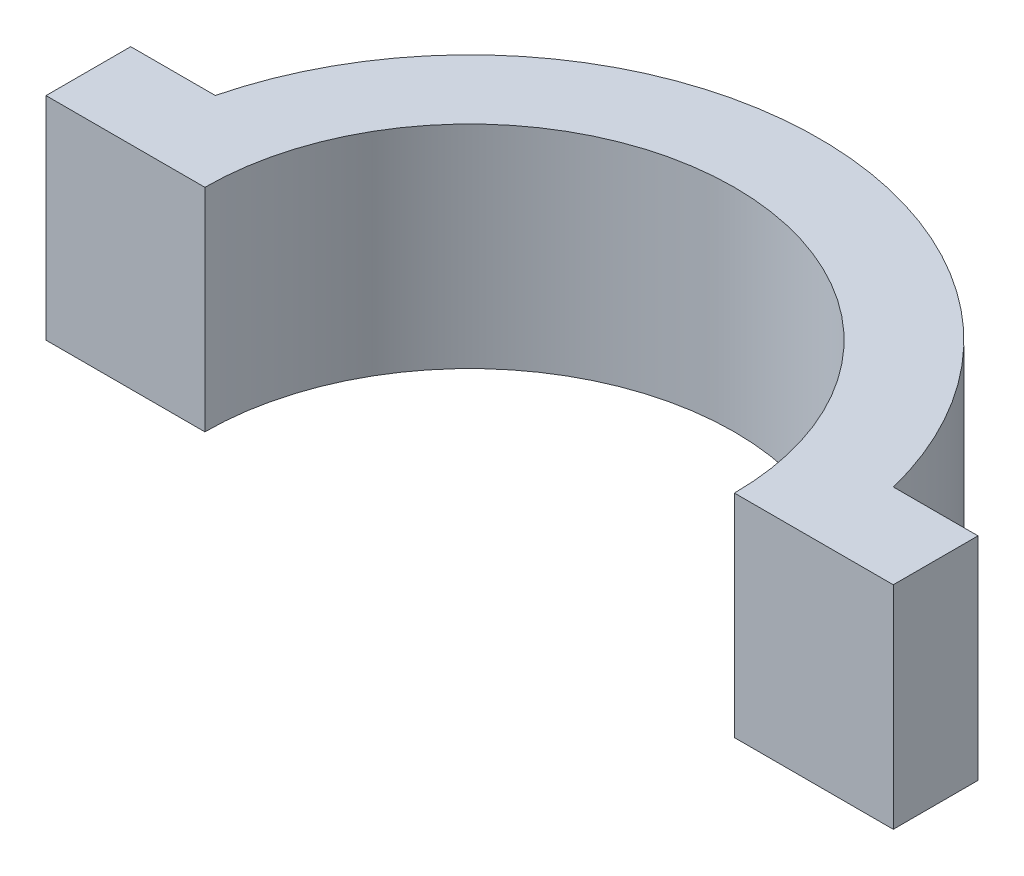
ISO-10303-21;
HEADER;
FILE_DESCRIPTION(('STEP AP214'),'2;1');
FILE_NAME('part.step','',(''),(''),'','','');
FILE_SCHEMA(('AUTOMOTIVE_DESIGN { 1 0 10303 214 1 1 1 1 }'));
ENDSEC;
DATA;
#1=APPLICATION_CONTEXT('core data for automotive mechanical design processes');
#2=APPLICATION_PROTOCOL_DEFINITION('international standard','automotive_design',2000,#1);
#3=PRODUCT_CONTEXT('',#1,'mechanical');
#4=PRODUCT('Part','Part','',(#3));
#5=PRODUCT_RELATED_PRODUCT_CATEGORY('part','',(#4));
#6=PRODUCT_DEFINITION_FORMATION('','',#4);
#7=PRODUCT_DEFINITION_CONTEXT('part definition',#1,'design');
#8=PRODUCT_DEFINITION('design','',#6,#7);
#9=PRODUCT_DEFINITION_SHAPE('','',#8);
#10=(LENGTH_UNIT() NAMED_UNIT(*) SI_UNIT(.MILLI.,.METRE.));
#11=(NAMED_UNIT(*) PLANE_ANGLE_UNIT() SI_UNIT($,.RADIAN.));
#12=(NAMED_UNIT(*) SI_UNIT($,.STERADIAN.) SOLID_ANGLE_UNIT());
#13=UNCERTAINTY_MEASURE_WITH_UNIT(LENGTH_MEASURE(1.E-05),#10,'distance_accuracy_value','');
#14=(GEOMETRIC_REPRESENTATION_CONTEXT(3) GLOBAL_UNCERTAINTY_ASSIGNED_CONTEXT((#13)) GLOBAL_UNIT_ASSIGNED_CONTEXT((#10,
#11,#12)) REPRESENTATION_CONTEXT('',''));
#15=CARTESIAN_POINT('',(0.,0.,0.));
#16=DIRECTION('',(0.,0.,1.));
#17=DIRECTION('',(1.,0.,0.));
#18=AXIS2_PLACEMENT_3D('',#15,#16,#17);
#19=CARTESIAN_POINT('',(0.,10.,-3.99999999999999));
#20=DIRECTION('',(0.,0.,1.));
#21=DIRECTION('',(1.,0.,0.));
#22=AXIS2_PLACEMENT_3D('',#19,#20,#21);
#23=PLANE('',#22);
#24=DIRECTION('',(-1.,0.,0.));
#25=VECTOR('',#24,1.);
#26=CARTESIAN_POINT('',(0.,0.,-3.99999999999999));
#27=LINE('',#26,#25);
#28=CARTESIAN_POINT('',(40.,0.,-4.));
#29=VERTEX_POINT('',#28);
#30=CARTESIAN_POINT('',(36.0078105935821,0.,-4.));
#31=VERTEX_POINT('',#30);
#32=EDGE_CURVE('E136',#29,#31,#27,.T.);
#33=ORIENTED_EDGE('',*,*,#32,.T.);
#34=DIRECTION('',(0.,-1.,0.));
#35=VECTOR('',#34,1.);
#36=CARTESIAN_POINT('',(36.0078105935821,10.,-4.));
#37=LINE('',#36,#35);
#38=CARTESIAN_POINT('',(36.0078105935821,10.,-4.));
#39=VERTEX_POINT('',#38);
#40=EDGE_CURVE('E11',#39,#31,#37,.T.);
#41=ORIENTED_EDGE('',*,*,#40,.F.);
#42=DIRECTION('',(-1.,0.,0.));
#43=VECTOR('',#42,1.);
#44=CARTESIAN_POINT('',(0.,10.,-3.99999999999999));
#45=LINE('',#44,#43);
#46=CARTESIAN_POINT('',(40.,10.,-4.));
#47=VERTEX_POINT('',#46);
#48=EDGE_CURVE('E153',#47,#39,#45,.T.);
#49=ORIENTED_EDGE('',*,*,#48,.F.);
#50=DIRECTION('',(0.,-1.,0.));
#51=VECTOR('',#50,1.);
#52=CARTESIAN_POINT('',(40.,10.,-4.));
#53=LINE('',#52,#51);
#54=EDGE_CURVE('E135',#47,#29,#53,.T.);
#55=ORIENTED_EDGE('',*,*,#54,.T.);
#56=EDGE_LOOP('',(#33,#41,#49,#55));
#57=FACE_BOUND('',#56,.T.);
#58=ADVANCED_FACE('F39',(#57),#23,.F.);
#59=CARTESIAN_POINT('',(20.,10.,0.));
#60=DIRECTION('',(0.,-1.,0.));
#61=DIRECTION('',(0.,0.,-1.));
#62=AXIS2_PLACEMENT_3D('',#59,#60,#61);
#63=CYLINDRICAL_SURFACE('',#62,16.5);
#64=CARTESIAN_POINT('',(20.,0.,0.));
#65=DIRECTION('',(0.,1.,0.));
#66=DIRECTION('',(0.,0.,1.));
#67=AXIS2_PLACEMENT_3D('',#64,#65,#66);
#68=CIRCLE('',#67,16.5);
#69=CARTESIAN_POINT('',(3.99218940641787,0.,-4.));
#70=VERTEX_POINT('',#69);
#71=EDGE_CURVE('E139',#31,#70,#68,.T.);
#72=ORIENTED_EDGE('',*,*,#71,.T.);
#73=DIRECTION('',(0.,-1.,0.));
#74=VECTOR('',#73,1.);
#75=CARTESIAN_POINT('',(3.99218940641787,10.,-4.));
#76=LINE('',#75,#74);
#77=CARTESIAN_POINT('',(3.99218940641787,10.,-4.));
#78=VERTEX_POINT('',#77);
#79=EDGE_CURVE('E47',#78,#70,#76,.T.);
#80=ORIENTED_EDGE('',*,*,#79,.F.);
#81=CARTESIAN_POINT('',(20.,10.,0.));
#82=DIRECTION('',(0.,1.,0.));
#83=DIRECTION('',(0.,0.,1.));
#84=AXIS2_PLACEMENT_3D('',#81,#82,#83);
#85=CIRCLE('',#84,16.5);
#86=EDGE_CURVE('E97',#39,#78,#85,.T.);
#87=ORIENTED_EDGE('',*,*,#86,.F.);
#88=ORIENTED_EDGE('',*,*,#40,.T.);
#89=EDGE_LOOP('',(#72,#80,#87,#88));
#90=FACE_BOUND('',#89,.T.);
#91=ADVANCED_FACE('F166',(#90),#63,.T.);
#92=CARTESIAN_POINT('',(0.,10.,-4.));
#93=DIRECTION('',(0.,0.,-1.));
#94=DIRECTION('',(-1.,0.,0.));
#95=AXIS2_PLACEMENT_3D('',#92,#93,#94);
#96=PLANE('',#95);
#97=DIRECTION('',(1.,0.,0.));
#98=VECTOR('',#97,1.);
#99=CARTESIAN_POINT('',(0.,0.,-4.));
#100=LINE('',#99,#98);
#101=CARTESIAN_POINT('',(0.,0.,-4.));
#102=VERTEX_POINT('',#101);
#103=EDGE_CURVE('E142',#102,#70,#100,.T.);
#104=ORIENTED_EDGE('',*,*,#103,.F.);
#105=DIRECTION('',(0.,-1.,0.));
#106=VECTOR('',#105,1.);
#107=CARTESIAN_POINT('',(0.,10.,-4.));
#108=LINE('',#107,#106);
#109=CARTESIAN_POINT('',(0.,10.,-4.));
#110=VERTEX_POINT('',#109);
#111=EDGE_CURVE('E159',#110,#102,#108,.T.);
#112=ORIENTED_EDGE('',*,*,#111,.F.);
#113=DIRECTION('',(1.,0.,0.));
#114=VECTOR('',#113,1.);
#115=CARTESIAN_POINT('',(0.,10.,-4.));
#116=LINE('',#115,#114);
#117=EDGE_CURVE('E165',#110,#78,#116,.T.);
#118=ORIENTED_EDGE('',*,*,#117,.T.);
#119=ORIENTED_EDGE('',*,*,#79,.T.);
#120=EDGE_LOOP('',(#104,#112,#118,#119));
#121=FACE_BOUND('',#120,.T.);
#122=ADVANCED_FACE('F163',(#121),#96,.T.);
#123=CARTESIAN_POINT('',(0.,10.,0.));
#124=DIRECTION('',(-1.,0.,0.));
#125=DIRECTION('',(0.,0.,1.));
#126=AXIS2_PLACEMENT_3D('',#123,#124,#125);
#127=PLANE('',#126);
#128=DIRECTION('',(0.,0.,-1.));
#129=VECTOR('',#128,1.);
#130=CARTESIAN_POINT('',(0.,0.,0.));
#131=LINE('',#130,#129);
#132=CARTESIAN_POINT('',(0.,0.,0.));
#133=VERTEX_POINT('',#132);
#134=EDGE_CURVE('E145',#133,#102,#131,.T.);
#135=ORIENTED_EDGE('',*,*,#134,.F.);
#136=DIRECTION('',(0.,-1.,0.));
#137=VECTOR('',#136,1.);
#138=CARTESIAN_POINT('',(0.,10.,0.));
#139=LINE('',#138,#137);
#140=CARTESIAN_POINT('',(0.,10.,0.));
#141=VERTEX_POINT('',#140);
#142=EDGE_CURVE('E157',#141,#133,#139,.T.);
#143=ORIENTED_EDGE('',*,*,#142,.F.);
#144=DIRECTION('',(0.,0.,-1.));
#145=VECTOR('',#144,1.);
#146=CARTESIAN_POINT('',(0.,10.,0.));
#147=LINE('',#146,#145);
#148=EDGE_CURVE('E131',#141,#110,#147,.T.);
#149=ORIENTED_EDGE('',*,*,#148,.T.);
#150=ORIENTED_EDGE('',*,*,#111,.T.);
#151=EDGE_LOOP('',(#135,#143,#149,#150));
#152=FACE_BOUND('',#151,.T.);
#153=ADVANCED_FACE('F174',(#152),#127,.T.);
#154=CARTESIAN_POINT('',(0.,10.,0.));
#155=DIRECTION('',(0.,0.,-1.));
#156=DIRECTION('',(-1.,0.,0.));
#157=AXIS2_PLACEMENT_3D('',#154,#155,#156);
#158=PLANE('',#157);
#159=DIRECTION('',(1.,0.,0.));
#160=VECTOR('',#159,1.);
#161=CARTESIAN_POINT('',(0.,0.,0.));
#162=LINE('',#161,#160);
#163=CARTESIAN_POINT('',(7.5,0.,0.));
#164=VERTEX_POINT('',#163);
#165=EDGE_CURVE('E148',#133,#164,#162,.T.);
#166=ORIENTED_EDGE('',*,*,#165,.T.);
#167=DIRECTION('',(0.,-1.,0.));
#168=VECTOR('',#167,1.);
#169=CARTESIAN_POINT('',(7.5,10.,0.));
#170=LINE('',#169,#168);
#171=CARTESIAN_POINT('',(7.5,10.,0.));
#172=VERTEX_POINT('',#171);
#173=EDGE_CURVE('E119',#172,#164,#170,.T.);
#174=ORIENTED_EDGE('',*,*,#173,.F.);
#175=DIRECTION('',(1.,0.,0.));
#176=VECTOR('',#175,1.);
#177=CARTESIAN_POINT('',(0.,10.,0.));
#178=LINE('',#177,#176);
#179=EDGE_CURVE('E125',#141,#172,#178,.T.);
#180=ORIENTED_EDGE('',*,*,#179,.F.);
#181=ORIENTED_EDGE('',*,*,#142,.T.);
#182=EDGE_LOOP('',(#166,#174,#180,#181));
#183=FACE_BOUND('',#182,.T.);
#184=ADVANCED_FACE('F190',(#183),#158,.F.);
#185=CARTESIAN_POINT('',(20.,10.,0.));
#186=DIRECTION('',(0.,-1.,0.));
#187=DIRECTION('',(0.,0.,-1.));
#188=AXIS2_PLACEMENT_3D('',#185,#186,#187);
#189=CYLINDRICAL_SURFACE('',#188,12.5);
#190=CARTESIAN_POINT('',(20.,0.,0.));
#191=DIRECTION('',(0.,1.,0.));
#192=DIRECTION('',(0.,0.,1.));
#193=AXIS2_PLACEMENT_3D('',#190,#191,#192);
#194=CIRCLE('',#193,12.5);
#195=CARTESIAN_POINT('',(32.5,0.,0.));
#196=VERTEX_POINT('',#195);
#197=EDGE_CURVE('E118',#196,#164,#194,.T.);
#198=ORIENTED_EDGE('',*,*,#197,.F.);
#199=DIRECTION('',(0.,-1.,0.));
#200=VECTOR('',#199,1.);
#201=CARTESIAN_POINT('',(32.5,10.,0.));
#202=LINE('',#201,#200);
#203=CARTESIAN_POINT('',(32.5,10.,0.));
#204=VERTEX_POINT('',#203);
#205=EDGE_CURVE('E112',#204,#196,#202,.T.);
#206=ORIENTED_EDGE('',*,*,#205,.F.);
#207=CARTESIAN_POINT('',(20.,10.,0.));
#208=DIRECTION('',(0.,1.,0.));
#209=DIRECTION('',(0.,0.,1.));
#210=AXIS2_PLACEMENT_3D('',#207,#208,#209);
#211=CIRCLE('',#210,12.5);
#212=EDGE_CURVE('E116',#204,#172,#211,.T.);
#213=ORIENTED_EDGE('',*,*,#212,.T.);
#214=ORIENTED_EDGE('',*,*,#173,.T.);
#215=EDGE_LOOP('',(#198,#206,#213,#214));
#216=FACE_BOUND('',#215,.T.);
#217=ADVANCED_FACE('F114',(#216),#189,.F.);
#218=CARTESIAN_POINT('',(40.,0.,0.));
#219=VERTEX_POINT('',#218);
#220=EDGE_CURVE('E83',#196,#219,#162,.T.);
#221=ORIENTED_EDGE('',*,*,#220,.T.);
#222=DIRECTION('',(0.,-1.,0.));
#223=VECTOR('',#222,1.);
#224=CARTESIAN_POINT('',(40.,10.,0.));
#225=LINE('',#224,#223);
#226=CARTESIAN_POINT('',(40.,10.,0.));
#227=VERTEX_POINT('',#226);
#228=EDGE_CURVE('E120',#227,#219,#225,.T.);
#229=ORIENTED_EDGE('',*,*,#228,.F.);
#230=EDGE_CURVE('E122',#204,#227,#178,.T.);
#231=ORIENTED_EDGE('',*,*,#230,.F.);
#232=ORIENTED_EDGE('',*,*,#205,.T.);
#233=EDGE_LOOP('',(#221,#229,#231,#232));
#234=FACE_BOUND('',#233,.T.);
#235=ADVANCED_FACE('F123',(#234),#158,.F.);
#236=CARTESIAN_POINT('',(40.,10.,0.));
#237=DIRECTION('',(-1.,0.,0.));
#238=DIRECTION('',(0.,0.,1.));
#239=AXIS2_PLACEMENT_3D('',#236,#237,#238);
#240=PLANE('',#239);
#241=DIRECTION('',(0.,0.,-1.));
#242=VECTOR('',#241,1.);
#243=CARTESIAN_POINT('',(40.,0.,0.));
#244=LINE('',#243,#242);
#245=EDGE_CURVE('E89',#219,#29,#244,.T.);
#246=ORIENTED_EDGE('',*,*,#245,.T.);
#247=ORIENTED_EDGE('',*,*,#54,.F.);
#248=DIRECTION('',(0.,0.,-1.));
#249=VECTOR('',#248,1.);
#250=CARTESIAN_POINT('',(40.,10.,0.));
#251=LINE('',#250,#249);
#252=EDGE_CURVE('E55',#227,#47,#251,.T.);
#253=ORIENTED_EDGE('',*,*,#252,.F.);
#254=ORIENTED_EDGE('',*,*,#228,.T.);
#255=EDGE_LOOP('',(#246,#247,#253,#254));
#256=FACE_BOUND('',#255,.T.);
#257=ADVANCED_FACE('F181',(#256),#240,.F.);
#258=CARTESIAN_POINT('',(0.,10.,0.));
#259=DIRECTION('',(0.,1.,0.));
#260=DIRECTION('',(0.,0.,1.));
#261=AXIS2_PLACEMENT_3D('',#258,#259,#260);
#262=PLANE('',#261);
#263=ORIENTED_EDGE('',*,*,#48,.T.);
#264=ORIENTED_EDGE('',*,*,#86,.T.);
#265=ORIENTED_EDGE('',*,*,#117,.F.);
#266=ORIENTED_EDGE('',*,*,#148,.F.);
#267=ORIENTED_EDGE('',*,*,#179,.T.);
#268=ORIENTED_EDGE('',*,*,#212,.F.);
#269=ORIENTED_EDGE('',*,*,#230,.T.);
#270=ORIENTED_EDGE('',*,*,#252,.T.);
#271=EDGE_LOOP('',(#263,#264,#265,#266,#267,#268,#269,#270));
#272=FACE_BOUND('',#271,.T.);
#273=ADVANCED_FACE('F126',(#272),#262,.T.);
#274=CARTESIAN_POINT('',(0.,0.,0.));
#275=DIRECTION('',(0.,1.,0.));
#276=DIRECTION('',(0.,0.,1.));
#277=AXIS2_PLACEMENT_3D('',#274,#275,#276);
#278=PLANE('',#277);
#279=ORIENTED_EDGE('',*,*,#32,.F.);
#280=ORIENTED_EDGE('',*,*,#245,.F.);
#281=ORIENTED_EDGE('',*,*,#220,.F.);
#282=ORIENTED_EDGE('',*,*,#197,.T.);
#283=ORIENTED_EDGE('',*,*,#165,.F.);
#284=ORIENTED_EDGE('',*,*,#134,.T.);
#285=ORIENTED_EDGE('',*,*,#103,.T.);
#286=ORIENTED_EDGE('',*,*,#71,.F.);
#287=EDGE_LOOP('',(#279,#280,#281,#282,#283,#284,#285,#286));
#288=FACE_BOUND('',#287,.T.);
#289=ADVANCED_FACE('F170',(#288),#278,.F.);
#290=CLOSED_SHELL('',(#58,#91,#122,#153,#184,#217,#235,#257,#273,#289));
#291=MANIFOLD_SOLID_BREP('B2',#290);
#292=ADVANCED_BREP_SHAPE_REPRESENTATION('',(#18,#291),#14);
#293=SHAPE_DEFINITION_REPRESENTATION(#9,#292);
ENDSEC;
END-ISO-10303-21;
